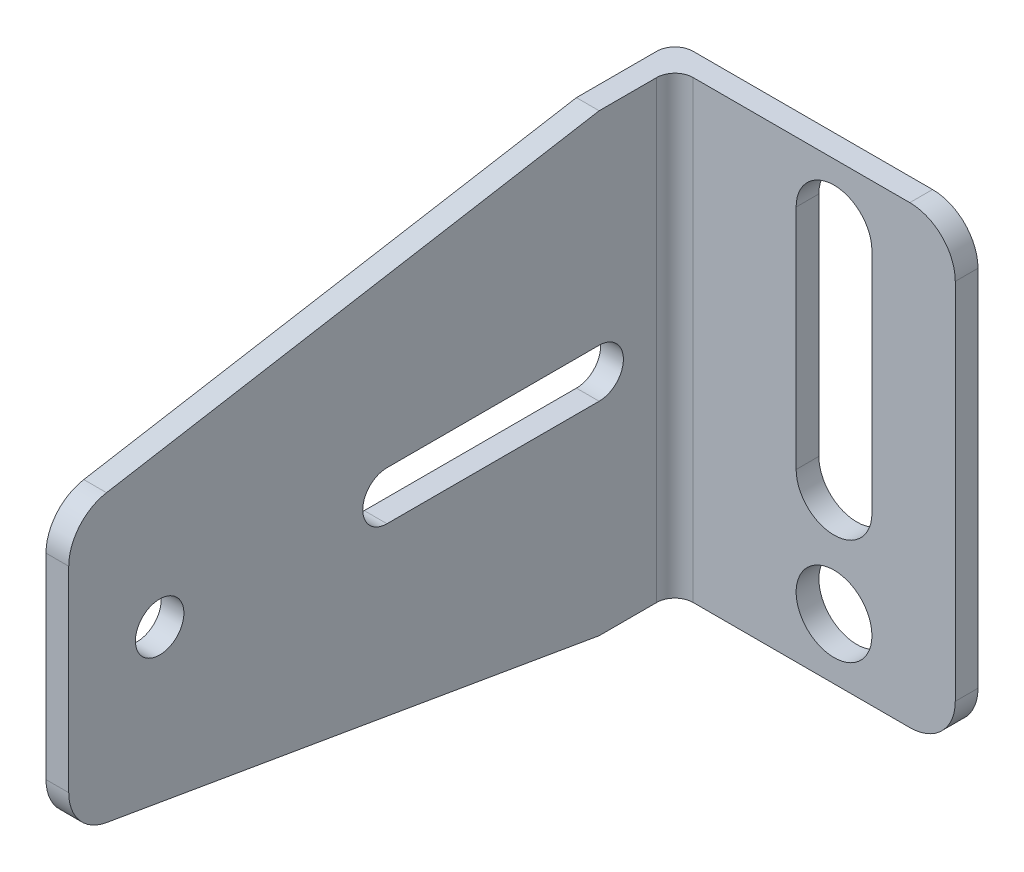
ISO-10303-21;
HEADER;
FILE_DESCRIPTION(('STEP AP214'),'2;1');
FILE_NAME('part.step','',(''),(''),'','','');
FILE_SCHEMA(('AUTOMOTIVE_DESIGN { 1 0 10303 214 1 1 1 1 }'));
ENDSEC;
DATA;
#1=APPLICATION_CONTEXT('core data for automotive mechanical design processes');
#2=APPLICATION_PROTOCOL_DEFINITION('international standard','automotive_design',2000,#1);
#3=PRODUCT_CONTEXT('',#1,'mechanical');
#4=PRODUCT('Part','Part','',(#3));
#5=PRODUCT_RELATED_PRODUCT_CATEGORY('part','',(#4));
#6=PRODUCT_DEFINITION_FORMATION('','',#4);
#7=PRODUCT_DEFINITION_CONTEXT('part definition',#1,'design');
#8=PRODUCT_DEFINITION('design','',#6,#7);
#9=PRODUCT_DEFINITION_SHAPE('','',#8);
#10=(LENGTH_UNIT() NAMED_UNIT(*) SI_UNIT(.MILLI.,.METRE.));
#11=(NAMED_UNIT(*) PLANE_ANGLE_UNIT() SI_UNIT($,.RADIAN.));
#12=(NAMED_UNIT(*) SI_UNIT($,.STERADIAN.) SOLID_ANGLE_UNIT());
#13=UNCERTAINTY_MEASURE_WITH_UNIT(LENGTH_MEASURE(1.E-05),#10,'distance_accuracy_value','');
#14=(GEOMETRIC_REPRESENTATION_CONTEXT(3) GLOBAL_UNCERTAINTY_ASSIGNED_CONTEXT((#13)) GLOBAL_UNIT_ASSIGNED_CONTEXT((#10,
#11,#12)) REPRESENTATION_CONTEXT('',''));
#15=CARTESIAN_POINT('',(0.,0.,0.));
#16=DIRECTION('',(0.,0.,1.));
#17=DIRECTION('',(1.,0.,0.));
#18=AXIS2_PLACEMENT_3D('',#15,#16,#17);
#19=CARTESIAN_POINT('',(0.,0.,1.5));
#20=DIRECTION('',(0.,0.,1.));
#21=DIRECTION('',(1.,0.,0.));
#22=AXIS2_PLACEMENT_3D('',#19,#20,#21);
#23=PLANE('',#22);
#24=DIRECTION('',(0.,-1.,0.));
#25=VECTOR('',#24,1.);
#26=CARTESIAN_POINT('',(9.5,-4.,1.5));
#27=LINE('',#26,#25);
#28=CARTESIAN_POINT('',(9.5,-4.,1.5));
#29=VERTEX_POINT('',#28);
#30=CARTESIAN_POINT('',(9.5,-19.,1.5));
#31=VERTEX_POINT('',#30);
#32=EDGE_CURVE('E269',#29,#31,#27,.T.);
#33=ORIENTED_EDGE('',*,*,#32,.F.);
#34=CARTESIAN_POINT('',(12.,-4.,1.5));
#35=DIRECTION('',(0.,0.,1.));
#36=DIRECTION('',(1.,0.,0.));
#37=AXIS2_PLACEMENT_3D('',#34,#35,#36);
#38=CIRCLE('',#37,2.5);
#39=CARTESIAN_POINT('',(14.5,-4.,1.5));
#40=VERTEX_POINT('',#39);
#41=EDGE_CURVE('E267',#40,#29,#38,.T.);
#42=ORIENTED_EDGE('',*,*,#41,.F.);
#43=DIRECTION('',(0.,1.,0.));
#44=VECTOR('',#43,1.);
#45=CARTESIAN_POINT('',(14.5,-4.,1.5));
#46=LINE('',#45,#44);
#47=CARTESIAN_POINT('',(14.5,-19.,1.5));
#48=VERTEX_POINT('',#47);
#49=EDGE_CURVE('E275',#48,#40,#46,.T.);
#50=ORIENTED_EDGE('',*,*,#49,.F.);
#51=CARTESIAN_POINT('',(12.,-19.,1.5));
#52=DIRECTION('',(0.,0.,1.));
#53=DIRECTION('',(1.,0.,0.));
#54=AXIS2_PLACEMENT_3D('',#51,#52,#53);
#55=CIRCLE('',#54,2.5);
#56=EDGE_CURVE('E272',#31,#48,#55,.T.);
#57=ORIENTED_EDGE('',*,*,#56,.F.);
#58=EDGE_LOOP('',(#33,#42,#50,#57));
#59=FACE_BOUND('',#58,.T.);
#60=CARTESIAN_POINT('',(12.,-26.,1.5));
#61=DIRECTION('',(0.,0.,1.));
#62=DIRECTION('',(1.,0.,0.));
#63=AXIS2_PLACEMENT_3D('',#60,#61,#62);
#64=CIRCLE('',#63,2.49999999999999);
#65=CARTESIAN_POINT('',(14.5,-26.,1.5));
#66=VERTEX_POINT('',#65);
#67=EDGE_CURVE('E261',#66,#66,#64,.T.);
#68=ORIENTED_EDGE('',*,*,#67,.F.);
#69=EDGE_LOOP('',(#68));
#70=FACE_BOUND('',#69,.T.);
#71=DIRECTION('',(1.,0.,0.));
#72=VECTOR('',#71,1.);
#73=CARTESIAN_POINT('',(0.,-30.,1.5));
#74=LINE('',#73,#72);
#75=CARTESIAN_POINT('',(2.7,-30.,1.5));
#76=VERTEX_POINT('',#75);
#77=CARTESIAN_POINT('',(17.,-30.,1.5));
#78=VERTEX_POINT('',#77);
#79=EDGE_CURVE('E298',#76,#78,#74,.T.);
#80=ORIENTED_EDGE('',*,*,#79,.T.);
#81=CARTESIAN_POINT('',(17.,-27.,1.5));
#82=DIRECTION('',(0.,0.,1.));
#83=DIRECTION('',(1.,0.,0.));
#84=AXIS2_PLACEMENT_3D('',#81,#82,#83);
#85=CIRCLE('',#84,3.);
#86=CARTESIAN_POINT('',(20.,-27.,1.5));
#87=VERTEX_POINT('',#86);
#88=EDGE_CURVE('E40',#78,#87,#85,.T.);
#89=ORIENTED_EDGE('',*,*,#88,.T.);
#90=DIRECTION('',(0.,1.,0.));
#91=VECTOR('',#90,1.);
#92=CARTESIAN_POINT('',(20.,0.,1.5));
#93=LINE('',#92,#91);
#94=CARTESIAN_POINT('',(20.,-3.,1.5));
#95=VERTEX_POINT('',#94);
#96=EDGE_CURVE('E300',#87,#95,#93,.T.);
#97=ORIENTED_EDGE('',*,*,#96,.T.);
#98=CARTESIAN_POINT('',(17.,-3.,1.5));
#99=DIRECTION('',(0.,0.,1.));
#100=DIRECTION('',(1.,0.,0.));
#101=AXIS2_PLACEMENT_3D('',#98,#99,#100);
#102=CIRCLE('',#101,3.);
#103=CARTESIAN_POINT('',(17.,0.,1.5));
#104=VERTEX_POINT('',#103);
#105=EDGE_CURVE('E47',#95,#104,#102,.T.);
#106=ORIENTED_EDGE('',*,*,#105,.T.);
#107=DIRECTION('',(-1.,0.,0.));
#108=VECTOR('',#107,1.);
#109=CARTESIAN_POINT('',(0.,0.,1.5));
#110=LINE('',#109,#108);
#111=CARTESIAN_POINT('',(2.7,0.,1.5));
#112=VERTEX_POINT('',#111);
#113=EDGE_CURVE('E303',#104,#112,#110,.T.);
#114=ORIENTED_EDGE('',*,*,#113,.T.);
#115=DIRECTION('',(0.,-1.,0.));
#116=VECTOR('',#115,1.);
#117=CARTESIAN_POINT('',(2.7,0.,1.5));
#118=LINE('',#117,#116);
#119=EDGE_CURVE('E326',#112,#76,#118,.T.);
#120=ORIENTED_EDGE('',*,*,#119,.T.);
#121=EDGE_LOOP('',(#80,#89,#97,#106,#114,#120));
#122=FACE_BOUND('',#121,.T.);
#123=ADVANCED_FACE('F32',(#59,#70,#122),#23,.T.);
#124=CARTESIAN_POINT('',(0.,0.,0.));
#125=DIRECTION('',(0.,0.,1.));
#126=DIRECTION('',(1.,0.,0.));
#127=AXIS2_PLACEMENT_3D('',#124,#125,#126);
#128=PLANE('',#127);
#129=DIRECTION('',(0.,1.,0.));
#130=VECTOR('',#129,1.);
#131=CARTESIAN_POINT('',(20.,0.,0.));
#132=LINE('',#131,#130);
#133=CARTESIAN_POINT('',(20.,-27.,0.));
#134=VERTEX_POINT('',#133);
#135=CARTESIAN_POINT('',(20.,-3.,0.));
#136=VERTEX_POINT('',#135);
#137=EDGE_CURVE('E307',#134,#136,#132,.T.);
#138=ORIENTED_EDGE('',*,*,#137,.F.);
#139=CARTESIAN_POINT('',(17.,-27.,0.));
#140=DIRECTION('',(0.,0.,1.));
#141=DIRECTION('',(1.,0.,0.));
#142=AXIS2_PLACEMENT_3D('',#139,#140,#141);
#143=CIRCLE('',#142,3.);
#144=CARTESIAN_POINT('',(17.,-30.,0.));
#145=VERTEX_POINT('',#144);
#146=EDGE_CURVE('E361',#134,#145,#143,.F.);
#147=ORIENTED_EDGE('',*,*,#146,.T.);
#148=DIRECTION('',(1.,0.,0.));
#149=VECTOR('',#148,1.);
#150=CARTESIAN_POINT('',(0.,-30.,0.));
#151=LINE('',#150,#149);
#152=CARTESIAN_POINT('',(1.2,-30.,0.));
#153=VERTEX_POINT('',#152);
#154=EDGE_CURVE('E297',#153,#145,#151,.T.);
#155=ORIENTED_EDGE('',*,*,#154,.F.);
#156=DIRECTION('',(0.,-1.,0.));
#157=VECTOR('',#156,1.);
#158=CARTESIAN_POINT('',(1.2,0.,0.));
#159=LINE('',#158,#157);
#160=CARTESIAN_POINT('',(1.2,0.,0.));
#161=VERTEX_POINT('',#160);
#162=EDGE_CURVE('E321',#153,#161,#159,.F.);
#163=ORIENTED_EDGE('',*,*,#162,.T.);
#164=DIRECTION('',(-1.,0.,0.));
#165=VECTOR('',#164,1.);
#166=CARTESIAN_POINT('',(0.,0.,0.));
#167=LINE('',#166,#165);
#168=CARTESIAN_POINT('',(17.,0.,0.));
#169=VERTEX_POINT('',#168);
#170=EDGE_CURVE('E301',#169,#161,#167,.T.);
#171=ORIENTED_EDGE('',*,*,#170,.F.);
#172=CARTESIAN_POINT('',(17.,-3.,0.));
#173=DIRECTION('',(0.,0.,1.));
#174=DIRECTION('',(1.,0.,0.));
#175=AXIS2_PLACEMENT_3D('',#172,#173,#174);
#176=CIRCLE('',#175,3.);
#177=EDGE_CURVE('E359',#169,#136,#176,.F.);
#178=ORIENTED_EDGE('',*,*,#177,.T.);
#179=EDGE_LOOP('',(#138,#147,#155,#163,#171,#178));
#180=FACE_BOUND('',#179,.T.);
#181=CARTESIAN_POINT('',(12.,-4.,0.));
#182=DIRECTION('',(0.,0.,1.));
#183=DIRECTION('',(1.,0.,0.));
#184=AXIS2_PLACEMENT_3D('',#181,#182,#183);
#185=CIRCLE('',#184,2.5);
#186=CARTESIAN_POINT('',(14.5,-4.,0.));
#187=VERTEX_POINT('',#186);
#188=CARTESIAN_POINT('',(9.5,-4.,0.));
#189=VERTEX_POINT('',#188);
#190=EDGE_CURVE('E264',#187,#189,#185,.T.);
#191=ORIENTED_EDGE('',*,*,#190,.T.);
#192=DIRECTION('',(0.,-1.,0.));
#193=VECTOR('',#192,1.);
#194=CARTESIAN_POINT('',(9.5,-4.,0.));
#195=LINE('',#194,#193);
#196=CARTESIAN_POINT('',(9.5,-19.,0.));
#197=VERTEX_POINT('',#196);
#198=EDGE_CURVE('E280',#189,#197,#195,.T.);
#199=ORIENTED_EDGE('',*,*,#198,.T.);
#200=CARTESIAN_POINT('',(12.,-19.,0.));
#201=DIRECTION('',(0.,0.,1.));
#202=DIRECTION('',(1.,0.,0.));
#203=AXIS2_PLACEMENT_3D('',#200,#201,#202);
#204=CIRCLE('',#203,2.5);
#205=CARTESIAN_POINT('',(14.5,-19.,0.));
#206=VERTEX_POINT('',#205);
#207=EDGE_CURVE('E283',#197,#206,#204,.T.);
#208=ORIENTED_EDGE('',*,*,#207,.T.);
#209=DIRECTION('',(0.,1.,0.));
#210=VECTOR('',#209,1.);
#211=CARTESIAN_POINT('',(14.5,-4.,0.));
#212=LINE('',#211,#210);
#213=EDGE_CURVE('E270',#206,#187,#212,.T.);
#214=ORIENTED_EDGE('',*,*,#213,.T.);
#215=EDGE_LOOP('',(#191,#199,#208,#214));
#216=FACE_BOUND('',#215,.T.);
#217=CARTESIAN_POINT('',(12.,-26.,0.));
#218=DIRECTION('',(0.,0.,1.));
#219=DIRECTION('',(1.,0.,0.));
#220=AXIS2_PLACEMENT_3D('',#217,#218,#219);
#221=CIRCLE('',#220,2.49999999999999);
#222=CARTESIAN_POINT('',(14.5,-26.,0.));
#223=VERTEX_POINT('',#222);
#224=EDGE_CURVE('E258',#223,#223,#221,.T.);
#225=ORIENTED_EDGE('',*,*,#224,.T.);
#226=EDGE_LOOP('',(#225));
#227=FACE_BOUND('',#226,.T.);
#228=ADVANCED_FACE('F375',(#180,#216,#227),#128,.F.);
#229=CARTESIAN_POINT('',(0.,0.,1.5));
#230=DIRECTION('',(1.,0.,0.));
#231=DIRECTION('',(0.,1.,0.));
#232=AXIS2_PLACEMENT_3D('',#229,#230,#231);
#233=PLANE('',#232);
#234=DIRECTION('',(0.,0.168963815110846,0.985622254813267));
#235=VECTOR('',#234,1.);
#236=CARTESIAN_POINT('',(0.,-30.,6.5));
#237=LINE('',#236,#235);
#238=CARTESIAN_POINT('',(0.,-30.,6.5));
#239=VERTEX_POINT('',#238);
#240=CARTESIAN_POINT('',(0.,-24.427390037943,39.0068914453325));
#241=VERTEX_POINT('',#240);
#242=EDGE_CURVE('E231',#239,#241,#237,.T.);
#243=ORIENTED_EDGE('',*,*,#242,.T.);
#244=CARTESIAN_POINT('',(0.,-21.4705232735032,38.5));
#245=DIRECTION('',(1.,0.,0.));
#246=DIRECTION('',(0.,1.,0.));
#247=AXIS2_PLACEMENT_3D('',#244,#245,#246);
#248=CIRCLE('',#247,3.);
#249=CARTESIAN_POINT('',(0.,-21.4705232735032,41.5));
#250=VERTEX_POINT('',#249);
#251=EDGE_CURVE('E341',#241,#250,#248,.F.);
#252=ORIENTED_EDGE('',*,*,#251,.T.);
#253=DIRECTION('',(0.,1.,0.));
#254=VECTOR('',#253,1.);
#255=CARTESIAN_POINT('',(0.,-24.,41.5));
#256=LINE('',#255,#254);
#257=CARTESIAN_POINT('',(0.,-8.52947672649681,41.5));
#258=VERTEX_POINT('',#257);
#259=EDGE_CURVE('E251',#250,#258,#256,.T.);
#260=ORIENTED_EDGE('',*,*,#259,.T.);
#261=CARTESIAN_POINT('',(0.,-8.52947672649681,38.5));
#262=DIRECTION('',(1.,0.,0.));
#263=DIRECTION('',(0.,1.,0.));
#264=AXIS2_PLACEMENT_3D('',#261,#262,#263);
#265=CIRCLE('',#264,3.);
#266=CARTESIAN_POINT('',(0.,-5.57260996205701,39.0068914453325));
#267=VERTEX_POINT('',#266);
#268=EDGE_CURVE('E339',#258,#267,#265,.F.);
#269=ORIENTED_EDGE('',*,*,#268,.T.);
#270=DIRECTION('',(0.,0.168963815110846,-0.985622254813267));
#271=VECTOR('',#270,1.);
#272=CARTESIAN_POINT('',(0.,-6.,41.5));
#273=LINE('',#272,#271);
#274=CARTESIAN_POINT('',(0.,0.,6.5));
#275=VERTEX_POINT('',#274);
#276=EDGE_CURVE('E238',#267,#275,#273,.T.);
#277=ORIENTED_EDGE('',*,*,#276,.T.);
#278=DIRECTION('',(0.,0.,-1.));
#279=VECTOR('',#278,1.);
#280=CARTESIAN_POINT('',(0.,0.,1.5));
#281=LINE('',#280,#279);
#282=CARTESIAN_POINT('',(0.,0.,1.2));
#283=VERTEX_POINT('',#282);
#284=EDGE_CURVE('E305',#275,#283,#281,.T.);
#285=ORIENTED_EDGE('',*,*,#284,.T.);
#286=DIRECTION('',(0.,-1.,0.));
#287=VECTOR('',#286,1.);
#288=CARTESIAN_POINT('',(0.,0.,1.2));
#289=LINE('',#288,#287);
#290=CARTESIAN_POINT('',(0.,-30.,1.2));
#291=VERTEX_POINT('',#290);
#292=EDGE_CURVE('E316',#283,#291,#289,.T.);
#293=ORIENTED_EDGE('',*,*,#292,.T.);
#294=DIRECTION('',(0.,0.,-1.));
#295=VECTOR('',#294,1.);
#296=CARTESIAN_POINT('',(0.,-30.,1.5));
#297=LINE('',#296,#295);
#298=EDGE_CURVE('E313',#239,#291,#297,.T.);
#299=ORIENTED_EDGE('',*,*,#298,.F.);
#300=EDGE_LOOP('',(#243,#252,#260,#269,#277,#285,#293,#299));
#301=FACE_BOUND('',#300,.T.);
#302=CARTESIAN_POINT('',(0.,-15.,6.5));
#303=DIRECTION('',(-1.,0.,0.));
#304=DIRECTION('',(0.,-1.,0.));
#305=AXIS2_PLACEMENT_3D('',#302,#303,#304);
#306=CIRCLE('',#305,1.6);
#307=CARTESIAN_POINT('',(0.,-13.4,6.5));
#308=VERTEX_POINT('',#307);
#309=CARTESIAN_POINT('',(0.,-16.6,6.5));
#310=VERTEX_POINT('',#309);
#311=EDGE_CURVE('E191',#308,#310,#306,.T.);
#312=ORIENTED_EDGE('',*,*,#311,.F.);
#313=DIRECTION('',(0.,0.,-1.));
#314=VECTOR('',#313,1.);
#315=CARTESIAN_POINT('',(0.,-13.4,6.5));
#316=LINE('',#315,#314);
#317=CARTESIAN_POINT('',(0.,-13.4,20.5));
#318=VERTEX_POINT('',#317);
#319=EDGE_CURVE('E209',#318,#308,#316,.T.);
#320=ORIENTED_EDGE('',*,*,#319,.F.);
#321=CARTESIAN_POINT('',(0.,-15.,20.5));
#322=DIRECTION('',(-1.,0.,0.));
#323=DIRECTION('',(0.,-1.,0.));
#324=AXIS2_PLACEMENT_3D('',#321,#322,#323);
#325=CIRCLE('',#324,1.6);
#326=CARTESIAN_POINT('',(0.,-16.6,20.5));
#327=VERTEX_POINT('',#326);
#328=EDGE_CURVE('E212',#327,#318,#325,.T.);
#329=ORIENTED_EDGE('',*,*,#328,.F.);
#330=DIRECTION('',(0.,0.,1.));
#331=VECTOR('',#330,1.);
#332=CARTESIAN_POINT('',(0.,-16.6,6.5));
#333=LINE('',#332,#331);
#334=EDGE_CURVE('E218',#310,#327,#333,.T.);
#335=ORIENTED_EDGE('',*,*,#334,.F.);
#336=EDGE_LOOP('',(#312,#320,#329,#335));
#337=FACE_BOUND('',#336,.T.);
#338=CARTESIAN_POINT('',(0.,-15.,35.5));
#339=DIRECTION('',(-1.,0.,0.));
#340=DIRECTION('',(0.,-1.,0.));
#341=AXIS2_PLACEMENT_3D('',#338,#339,#340);
#342=CIRCLE('',#341,1.6);
#343=CARTESIAN_POINT('',(0.,-16.6,35.5));
#344=VERTEX_POINT('',#343);
#345=EDGE_CURVE('E224',#344,#344,#342,.T.);
#346=ORIENTED_EDGE('',*,*,#345,.F.);
#347=EDGE_LOOP('',(#346));
#348=FACE_BOUND('',#347,.T.);
#349=ADVANCED_FACE('F384',(#301,#337,#348),#233,.F.);
#350=CARTESIAN_POINT('',(0.,-30.,1.5));
#351=DIRECTION('',(0.,1.,0.));
#352=DIRECTION('',(-1.,0.,0.));
#353=AXIS2_PLACEMENT_3D('',#350,#351,#352);
#354=PLANE('',#353);
#355=ORIENTED_EDGE('',*,*,#154,.T.);
#356=DIRECTION('',(0.,0.,-1.));
#357=VECTOR('',#356,1.);
#358=CARTESIAN_POINT('',(17.,-30.,1.5));
#359=LINE('',#358,#357);
#360=EDGE_CURVE('E55',#145,#78,#359,.F.);
#361=ORIENTED_EDGE('',*,*,#360,.T.);
#362=ORIENTED_EDGE('',*,*,#79,.F.);
#363=CARTESIAN_POINT('',(2.7,-30.,2.7));
#364=DIRECTION('',(0.,1.,0.));
#365=DIRECTION('',(-1.,0.,0.));
#366=AXIS2_PLACEMENT_3D('',#363,#364,#365);
#367=CIRCLE('',#366,1.2);
#368=CARTESIAN_POINT('',(1.5,-30.,2.7));
#369=VERTEX_POINT('',#368);
#370=EDGE_CURVE('E331',#76,#369,#367,.T.);
#371=ORIENTED_EDGE('',*,*,#370,.T.);
#372=DIRECTION('',(0.,0.,1.));
#373=VECTOR('',#372,1.);
#374=CARTESIAN_POINT('',(1.5,-30.,1.5));
#375=LINE('',#374,#373);
#376=CARTESIAN_POINT('',(1.5,-30.,6.5));
#377=VERTEX_POINT('',#376);
#378=EDGE_CURVE('E237',#369,#377,#375,.T.);
#379=ORIENTED_EDGE('',*,*,#378,.T.);
#380=DIRECTION('',(-1.,0.,0.));
#381=VECTOR('',#380,1.);
#382=CARTESIAN_POINT('',(1.5,-30.,6.5));
#383=LINE('',#382,#381);
#384=EDGE_CURVE('E248',#377,#239,#383,.T.);
#385=ORIENTED_EDGE('',*,*,#384,.T.);
#386=ORIENTED_EDGE('',*,*,#298,.T.);
#387=CARTESIAN_POINT('',(1.2,-30.,1.2));
#388=DIRECTION('',(0.,1.,0.));
#389=DIRECTION('',(-1.,0.,0.));
#390=AXIS2_PLACEMENT_3D('',#387,#388,#389);
#391=CIRCLE('',#390,1.2);
#392=EDGE_CURVE('E319',#291,#153,#391,.F.);
#393=ORIENTED_EDGE('',*,*,#392,.T.);
#394=EDGE_LOOP('',(#355,#361,#362,#371,#379,#385,#386,#393));
#395=FACE_BOUND('',#394,.T.);
#396=ADVANCED_FACE('F378',(#395),#354,.F.);
#397=CARTESIAN_POINT('',(20.,0.,1.5));
#398=DIRECTION('',(-1.,0.,0.));
#399=DIRECTION('',(0.,-1.,0.));
#400=AXIS2_PLACEMENT_3D('',#397,#398,#399);
#401=PLANE('',#400);
#402=ORIENTED_EDGE('',*,*,#96,.F.);
#403=DIRECTION('',(0.,0.,-1.));
#404=VECTOR('',#403,1.);
#405=CARTESIAN_POINT('',(20.,-27.,1.5));
#406=LINE('',#405,#404);
#407=EDGE_CURVE('E356',#87,#134,#406,.T.);
#408=ORIENTED_EDGE('',*,*,#407,.T.);
#409=ORIENTED_EDGE('',*,*,#137,.T.);
#410=DIRECTION('',(0.,0.,-1.));
#411=VECTOR('',#410,1.);
#412=CARTESIAN_POINT('',(20.,-3.,1.5));
#413=LINE('',#412,#411);
#414=EDGE_CURVE('E354',#136,#95,#413,.F.);
#415=ORIENTED_EDGE('',*,*,#414,.T.);
#416=EDGE_LOOP('',(#402,#408,#409,#415));
#417=FACE_BOUND('',#416,.T.);
#418=ADVANCED_FACE('F369',(#417),#401,.F.);
#419=CARTESIAN_POINT('',(0.,0.,1.5));
#420=DIRECTION('',(0.,-1.,0.));
#421=DIRECTION('',(0.,0.,-1.));
#422=AXIS2_PLACEMENT_3D('',#419,#420,#421);
#423=PLANE('',#422);
#424=ORIENTED_EDGE('',*,*,#113,.F.);
#425=DIRECTION('',(0.,0.,-1.));
#426=VECTOR('',#425,1.);
#427=CARTESIAN_POINT('',(17.,0.,1.5));
#428=LINE('',#427,#426);
#429=EDGE_CURVE('E11',#104,#169,#428,.T.);
#430=ORIENTED_EDGE('',*,*,#429,.T.);
#431=ORIENTED_EDGE('',*,*,#170,.T.);
#432=CARTESIAN_POINT('',(1.2,0.,1.2));
#433=DIRECTION('',(0.,-1.,0.));
#434=DIRECTION('',(0.,0.,-1.));
#435=AXIS2_PLACEMENT_3D('',#432,#433,#434);
#436=CIRCLE('',#435,1.2);
#437=EDGE_CURVE('E324',#161,#283,#436,.F.);
#438=ORIENTED_EDGE('',*,*,#437,.T.);
#439=ORIENTED_EDGE('',*,*,#284,.F.);
#440=DIRECTION('',(-1.,0.,0.));
#441=VECTOR('',#440,1.);
#442=CARTESIAN_POINT('',(1.5,0.,6.5));
#443=LINE('',#442,#441);
#444=CARTESIAN_POINT('',(1.5,0.,6.5));
#445=VERTEX_POINT('',#444);
#446=EDGE_CURVE('E255',#445,#275,#443,.T.);
#447=ORIENTED_EDGE('',*,*,#446,.F.);
#448=DIRECTION('',(0.,0.,-1.));
#449=VECTOR('',#448,1.);
#450=CARTESIAN_POINT('',(1.5,0.,6.5));
#451=LINE('',#450,#449);
#452=CARTESIAN_POINT('',(1.5,0.,2.7));
#453=VERTEX_POINT('',#452);
#454=EDGE_CURVE('E234',#445,#453,#451,.T.);
#455=ORIENTED_EDGE('',*,*,#454,.T.);
#456=CARTESIAN_POINT('',(2.7,0.,2.7));
#457=DIRECTION('',(0.,-1.,0.));
#458=DIRECTION('',(0.,0.,-1.));
#459=AXIS2_PLACEMENT_3D('',#456,#457,#458);
#460=CIRCLE('',#459,1.2);
#461=EDGE_CURVE('E333',#453,#112,#460,.T.);
#462=ORIENTED_EDGE('',*,*,#461,.T.);
#463=EDGE_LOOP('',(#424,#430,#431,#438,#439,#447,#455,#462));
#464=FACE_BOUND('',#463,.T.);
#465=ADVANCED_FACE('F390',(#464),#423,.F.);
#466=CARTESIAN_POINT('',(12.,-4.,1.5));
#467=DIRECTION('',(0.,0.,-1.));
#468=DIRECTION('',(-1.,0.,0.));
#469=AXIS2_PLACEMENT_3D('',#466,#467,#468);
#470=CYLINDRICAL_SURFACE('',#469,2.5);
#471=ORIENTED_EDGE('',*,*,#190,.F.);
#472=DIRECTION('',(0.,0.,-1.));
#473=VECTOR('',#472,1.);
#474=CARTESIAN_POINT('',(14.5,-4.,1.5));
#475=LINE('',#474,#473);
#476=EDGE_CURVE('E277',#40,#187,#475,.T.);
#477=ORIENTED_EDGE('',*,*,#476,.F.);
#478=ORIENTED_EDGE('',*,*,#41,.T.);
#479=DIRECTION('',(0.,0.,-1.));
#480=VECTOR('',#479,1.);
#481=CARTESIAN_POINT('',(9.5,-4.,1.5));
#482=LINE('',#481,#480);
#483=EDGE_CURVE('E294',#29,#189,#482,.T.);
#484=ORIENTED_EDGE('',*,*,#483,.T.);
#485=EDGE_LOOP('',(#471,#477,#478,#484));
#486=FACE_BOUND('',#485,.T.);
#487=ADVANCED_FACE('F438',(#486),#470,.F.);
#488=CARTESIAN_POINT('',(9.5,-4.,1.5));
#489=DIRECTION('',(1.,0.,0.));
#490=DIRECTION('',(0.,1.,0.));
#491=AXIS2_PLACEMENT_3D('',#488,#489,#490);
#492=PLANE('',#491);
#493=ORIENTED_EDGE('',*,*,#198,.F.);
#494=ORIENTED_EDGE('',*,*,#483,.F.);
#495=ORIENTED_EDGE('',*,*,#32,.T.);
#496=DIRECTION('',(0.,0.,-1.));
#497=VECTOR('',#496,1.);
#498=CARTESIAN_POINT('',(9.5,-19.,1.5));
#499=LINE('',#498,#497);
#500=EDGE_CURVE('E292',#31,#197,#499,.T.);
#501=ORIENTED_EDGE('',*,*,#500,.T.);
#502=EDGE_LOOP('',(#493,#494,#495,#501));
#503=FACE_BOUND('',#502,.T.);
#504=ADVANCED_FACE('F615',(#503),#492,.T.);
#505=CARTESIAN_POINT('',(12.,-19.,1.5));
#506=DIRECTION('',(0.,0.,-1.));
#507=DIRECTION('',(-1.,0.,0.));
#508=AXIS2_PLACEMENT_3D('',#505,#506,#507);
#509=CYLINDRICAL_SURFACE('',#508,2.5);
#510=ORIENTED_EDGE('',*,*,#207,.F.);
#511=ORIENTED_EDGE('',*,*,#500,.F.);
#512=ORIENTED_EDGE('',*,*,#56,.T.);
#513=DIRECTION('',(0.,0.,-1.));
#514=VECTOR('',#513,1.);
#515=CARTESIAN_POINT('',(14.5,-19.,1.5));
#516=LINE('',#515,#514);
#517=EDGE_CURVE('E290',#48,#206,#516,.T.);
#518=ORIENTED_EDGE('',*,*,#517,.T.);
#519=EDGE_LOOP('',(#510,#511,#512,#518));
#520=FACE_BOUND('',#519,.T.);
#521=ADVANCED_FACE('F606',(#520),#509,.F.);
#522=CARTESIAN_POINT('',(14.5,-4.,1.5));
#523=DIRECTION('',(-1.,0.,0.));
#524=DIRECTION('',(0.,-1.,0.));
#525=AXIS2_PLACEMENT_3D('',#522,#523,#524);
#526=PLANE('',#525);
#527=ORIENTED_EDGE('',*,*,#213,.F.);
#528=ORIENTED_EDGE('',*,*,#517,.F.);
#529=ORIENTED_EDGE('',*,*,#49,.T.);
#530=ORIENTED_EDGE('',*,*,#476,.T.);
#531=EDGE_LOOP('',(#527,#528,#529,#530));
#532=FACE_BOUND('',#531,.T.);
#533=ADVANCED_FACE('F597',(#532),#526,.T.);
#534=CARTESIAN_POINT('',(12.,-26.,1.5));
#535=DIRECTION('',(0.,0.,-1.));
#536=DIRECTION('',(-1.,0.,0.));
#537=AXIS2_PLACEMENT_3D('',#534,#535,#536);
#538=CYLINDRICAL_SURFACE('',#537,2.49999999999999);
#539=ORIENTED_EDGE('',*,*,#67,.T.);
#540=EDGE_LOOP('',(#539));
#541=FACE_BOUND('',#540,.T.);
#542=ORIENTED_EDGE('',*,*,#224,.F.);
#543=EDGE_LOOP('',(#542));
#544=FACE_BOUND('',#543,.T.);
#545=ADVANCED_FACE('F557',(#541,#544),#538,.F.);
#546=CARTESIAN_POINT('',(1.5,-6.,41.5));
#547=DIRECTION('',(0.,0.985622254813267,0.168963815110846));
#548=DIRECTION('',(0.,-0.168963815110846,0.985622254813267));
#549=AXIS2_PLACEMENT_3D('',#546,#547,#548);
#550=PLANE('',#549);
#551=ORIENTED_EDGE('',*,*,#276,.F.);
#552=DIRECTION('',(-1.,0.,0.));
#553=VECTOR('',#552,1.);
#554=CARTESIAN_POINT('',(1.5,-5.57260996205701,39.0068914453325));
#555=LINE('',#554,#553);
#556=CARTESIAN_POINT('',(1.5,-5.57260996205701,39.0068914453325));
#557=VERTEX_POINT('',#556);
#558=EDGE_CURVE('E352',#267,#557,#555,.F.);
#559=ORIENTED_EDGE('',*,*,#558,.T.);
#560=DIRECTION('',(0.,0.168963815110846,-0.985622254813267));
#561=VECTOR('',#560,1.);
#562=CARTESIAN_POINT('',(1.5,-6.,41.5));
#563=LINE('',#562,#561);
#564=EDGE_CURVE('E246',#557,#445,#563,.T.);
#565=ORIENTED_EDGE('',*,*,#564,.T.);
#566=ORIENTED_EDGE('',*,*,#446,.T.);
#567=EDGE_LOOP('',(#551,#559,#565,#566));
#568=FACE_BOUND('',#567,.T.);
#569=ADVANCED_FACE('F393',(#568),#550,.T.);
#570=CARTESIAN_POINT('',(1.5,-24.,41.5));
#571=DIRECTION('',(0.,0.,1.));
#572=DIRECTION('',(1.,0.,0.));
#573=AXIS2_PLACEMENT_3D('',#570,#571,#572);
#574=PLANE('',#573);
#575=ORIENTED_EDGE('',*,*,#259,.F.);
#576=DIRECTION('',(-1.,0.,0.));
#577=VECTOR('',#576,1.);
#578=CARTESIAN_POINT('',(1.5,-21.4705232735032,41.5));
#579=LINE('',#578,#577);
#580=CARTESIAN_POINT('',(1.5,-21.4705232735032,41.5));
#581=VERTEX_POINT('',#580);
#582=EDGE_CURVE('E346',#250,#581,#579,.F.);
#583=ORIENTED_EDGE('',*,*,#582,.T.);
#584=DIRECTION('',(0.,1.,0.));
#585=VECTOR('',#584,1.);
#586=CARTESIAN_POINT('',(1.5,-24.,41.5));
#587=LINE('',#586,#585);
#588=CARTESIAN_POINT('',(1.5,-8.52947672649681,41.5));
#589=VERTEX_POINT('',#588);
#590=EDGE_CURVE('E243',#581,#589,#587,.T.);
#591=ORIENTED_EDGE('',*,*,#590,.T.);
#592=DIRECTION('',(-1.,0.,0.));
#593=VECTOR('',#592,1.);
#594=CARTESIAN_POINT('',(1.5,-8.52947672649681,41.5));
#595=LINE('',#594,#593);
#596=EDGE_CURVE('E343',#589,#258,#595,.T.);
#597=ORIENTED_EDGE('',*,*,#596,.T.);
#598=EDGE_LOOP('',(#575,#583,#591,#597));
#599=FACE_BOUND('',#598,.T.);
#600=ADVANCED_FACE('F404',(#599),#574,.T.);
#601=CARTESIAN_POINT('',(1.5,-30.,6.5));
#602=DIRECTION('',(0.,-0.985622254813267,0.168963815110846));
#603=DIRECTION('',(0.,-0.168963815110846,-0.985622254813267));
#604=AXIS2_PLACEMENT_3D('',#601,#602,#603);
#605=PLANE('',#604);
#606=DIRECTION('',(0.,0.168963815110846,0.985622254813267));
#607=VECTOR('',#606,1.);
#608=CARTESIAN_POINT('',(1.5,-30.,6.5));
#609=LINE('',#608,#607);
#610=CARTESIAN_POINT('',(1.5,-24.427390037943,39.0068914453325));
#611=VERTEX_POINT('',#610);
#612=EDGE_CURVE('E240',#377,#611,#609,.T.);
#613=ORIENTED_EDGE('',*,*,#612,.T.);
#614=DIRECTION('',(-1.,0.,0.));
#615=VECTOR('',#614,1.);
#616=CARTESIAN_POINT('',(1.5,-24.427390037943,39.0068914453325));
#617=LINE('',#616,#615);
#618=EDGE_CURVE('E336',#611,#241,#617,.T.);
#619=ORIENTED_EDGE('',*,*,#618,.T.);
#620=ORIENTED_EDGE('',*,*,#242,.F.);
#621=ORIENTED_EDGE('',*,*,#384,.F.);
#622=EDGE_LOOP('',(#613,#619,#620,#621));
#623=FACE_BOUND('',#622,.T.);
#624=ADVANCED_FACE('F412',(#623),#605,.T.);
#625=CARTESIAN_POINT('',(1.5,0.,0.));
#626=DIRECTION('',(-1.,0.,0.));
#627=DIRECTION('',(0.,-1.,0.));
#628=AXIS2_PLACEMENT_3D('',#625,#626,#627);
#629=PLANE('',#628);
#630=DIRECTION('',(0.,0.,-1.));
#631=VECTOR('',#630,1.);
#632=CARTESIAN_POINT('',(1.5,-13.4,6.5));
#633=LINE('',#632,#631);
#634=CARTESIAN_POINT('',(1.5,-13.4,20.5));
#635=VERTEX_POINT('',#634);
#636=CARTESIAN_POINT('',(1.5,-13.4,6.5));
#637=VERTEX_POINT('',#636);
#638=EDGE_CURVE('E196',#635,#637,#633,.T.);
#639=ORIENTED_EDGE('',*,*,#638,.T.);
#640=CARTESIAN_POINT('',(1.5,-15.,6.5));
#641=DIRECTION('',(-1.,0.,0.));
#642=DIRECTION('',(0.,-1.,0.));
#643=AXIS2_PLACEMENT_3D('',#640,#641,#642);
#644=CIRCLE('',#643,1.6);
#645=CARTESIAN_POINT('',(1.5,-16.6,6.5));
#646=VERTEX_POINT('',#645);
#647=EDGE_CURVE('E188',#637,#646,#644,.T.);
#648=ORIENTED_EDGE('',*,*,#647,.T.);
#649=DIRECTION('',(0.,0.,1.));
#650=VECTOR('',#649,1.);
#651=CARTESIAN_POINT('',(1.5,-16.6,6.5));
#652=LINE('',#651,#650);
#653=CARTESIAN_POINT('',(1.5,-16.6,20.5));
#654=VERTEX_POINT('',#653);
#655=EDGE_CURVE('E200',#646,#654,#652,.T.);
#656=ORIENTED_EDGE('',*,*,#655,.T.);
#657=CARTESIAN_POINT('',(1.5,-15.,20.5));
#658=DIRECTION('',(-1.,0.,0.));
#659=DIRECTION('',(0.,-1.,0.));
#660=AXIS2_PLACEMENT_3D('',#657,#658,#659);
#661=CIRCLE('',#660,1.6);
#662=EDGE_CURVE('E204',#654,#635,#661,.T.);
#663=ORIENTED_EDGE('',*,*,#662,.T.);
#664=EDGE_LOOP('',(#639,#648,#656,#663));
#665=FACE_BOUND('',#664,.T.);
#666=CARTESIAN_POINT('',(1.5,-15.,35.5));
#667=DIRECTION('',(-1.,0.,0.));
#668=DIRECTION('',(0.,-1.,0.));
#669=AXIS2_PLACEMENT_3D('',#666,#667,#668);
#670=CIRCLE('',#669,1.6);
#671=CARTESIAN_POINT('',(1.5,-16.6,35.5));
#672=VERTEX_POINT('',#671);
#673=EDGE_CURVE('E228',#672,#672,#670,.T.);
#674=ORIENTED_EDGE('',*,*,#673,.T.);
#675=EDGE_LOOP('',(#674));
#676=FACE_BOUND('',#675,.T.);
#677=ORIENTED_EDGE('',*,*,#590,.F.);
#678=CARTESIAN_POINT('',(1.5,-21.4705232735032,38.5));
#679=DIRECTION('',(-1.,0.,0.));
#680=DIRECTION('',(0.,-1.,0.));
#681=AXIS2_PLACEMENT_3D('',#678,#679,#680);
#682=CIRCLE('',#681,3.);
#683=EDGE_CURVE('E350',#581,#611,#682,.F.);
#684=ORIENTED_EDGE('',*,*,#683,.T.);
#685=ORIENTED_EDGE('',*,*,#612,.F.);
#686=ORIENTED_EDGE('',*,*,#378,.F.);
#687=DIRECTION('',(0.,-1.,0.));
#688=VECTOR('',#687,1.);
#689=CARTESIAN_POINT('',(1.5,0.,2.7));
#690=LINE('',#689,#688);
#691=EDGE_CURVE('E329',#369,#453,#690,.F.);
#692=ORIENTED_EDGE('',*,*,#691,.T.);
#693=ORIENTED_EDGE('',*,*,#454,.F.);
#694=ORIENTED_EDGE('',*,*,#564,.F.);
#695=CARTESIAN_POINT('',(1.5,-8.52947672649681,38.5));
#696=DIRECTION('',(-1.,0.,0.));
#697=DIRECTION('',(0.,-1.,0.));
#698=AXIS2_PLACEMENT_3D('',#695,#696,#697);
#699=CIRCLE('',#698,3.);
#700=EDGE_CURVE('E348',#557,#589,#699,.F.);
#701=ORIENTED_EDGE('',*,*,#700,.T.);
#702=EDGE_LOOP('',(#677,#684,#685,#686,#692,#693,#694,#701));
#703=FACE_BOUND('',#702,.T.);
#704=ADVANCED_FACE('F206',(#665,#676,#703),#629,.F.);
#705=CARTESIAN_POINT('',(1.5,-15.,35.5));
#706=DIRECTION('',(-1.,0.,0.));
#707=DIRECTION('',(0.,-1.,0.));
#708=AXIS2_PLACEMENT_3D('',#705,#706,#707);
#709=CYLINDRICAL_SURFACE('',#708,1.6);
#710=ORIENTED_EDGE('',*,*,#673,.F.);
#711=EDGE_LOOP('',(#710));
#712=FACE_BOUND('',#711,.T.);
#713=ORIENTED_EDGE('',*,*,#345,.T.);
#714=EDGE_LOOP('',(#713));
#715=FACE_BOUND('',#714,.T.);
#716=ADVANCED_FACE('F520',(#712,#715),#709,.F.);
#717=CARTESIAN_POINT('',(1.5,-15.,6.5));
#718=DIRECTION('',(-1.,0.,0.));
#719=DIRECTION('',(0.,-1.,0.));
#720=AXIS2_PLACEMENT_3D('',#717,#718,#719);
#721=CYLINDRICAL_SURFACE('',#720,1.6);
#722=ORIENTED_EDGE('',*,*,#311,.T.);
#723=DIRECTION('',(-1.,0.,0.));
#724=VECTOR('',#723,1.);
#725=CARTESIAN_POINT('',(1.5,-16.6,6.5));
#726=LINE('',#725,#724);
#727=EDGE_CURVE('E184',#646,#310,#726,.T.);
#728=ORIENTED_EDGE('',*,*,#727,.F.);
#729=ORIENTED_EDGE('',*,*,#647,.F.);
#730=DIRECTION('',(-1.,0.,0.));
#731=VECTOR('',#730,1.);
#732=CARTESIAN_POINT('',(1.5,-13.4,6.5));
#733=LINE('',#732,#731);
#734=EDGE_CURVE('E222',#637,#308,#733,.T.);
#735=ORIENTED_EDGE('',*,*,#734,.T.);
#736=EDGE_LOOP('',(#722,#728,#729,#735));
#737=FACE_BOUND('',#736,.T.);
#738=ADVANCED_FACE('F186',(#737),#721,.F.);
#739=CARTESIAN_POINT('',(1.5,-13.4,6.5));
#740=DIRECTION('',(0.,1.,0.));
#741=DIRECTION('',(0.,0.,1.));
#742=AXIS2_PLACEMENT_3D('',#739,#740,#741);
#743=PLANE('',#742);
#744=ORIENTED_EDGE('',*,*,#319,.T.);
#745=ORIENTED_EDGE('',*,*,#734,.F.);
#746=ORIENTED_EDGE('',*,*,#638,.F.);
#747=DIRECTION('',(-1.,0.,0.));
#748=VECTOR('',#747,1.);
#749=CARTESIAN_POINT('',(1.5,-13.4,20.5));
#750=LINE('',#749,#748);
#751=EDGE_CURVE('E225',#635,#318,#750,.T.);
#752=ORIENTED_EDGE('',*,*,#751,.T.);
#753=EDGE_LOOP('',(#744,#745,#746,#752));
#754=FACE_BOUND('',#753,.T.);
#755=ADVANCED_FACE('F503',(#754),#743,.F.);
#756=CARTESIAN_POINT('',(1.5,-15.,20.5));
#757=DIRECTION('',(-1.,0.,0.));
#758=DIRECTION('',(0.,-1.,0.));
#759=AXIS2_PLACEMENT_3D('',#756,#757,#758);
#760=CYLINDRICAL_SURFACE('',#759,1.6);
#761=ORIENTED_EDGE('',*,*,#328,.T.);
#762=ORIENTED_EDGE('',*,*,#751,.F.);
#763=ORIENTED_EDGE('',*,*,#662,.F.);
#764=DIRECTION('',(-1.,0.,0.));
#765=VECTOR('',#764,1.);
#766=CARTESIAN_POINT('',(1.5,-16.6,20.5));
#767=LINE('',#766,#765);
#768=EDGE_CURVE('E195',#654,#327,#767,.T.);
#769=ORIENTED_EDGE('',*,*,#768,.T.);
#770=EDGE_LOOP('',(#761,#762,#763,#769));
#771=FACE_BOUND('',#770,.T.);
#772=ADVANCED_FACE('F495',(#771),#760,.F.);
#773=CARTESIAN_POINT('',(1.5,-16.6,6.5));
#774=DIRECTION('',(0.,-1.,0.));
#775=DIRECTION('',(0.,0.,-1.));
#776=AXIS2_PLACEMENT_3D('',#773,#774,#775);
#777=PLANE('',#776);
#778=ORIENTED_EDGE('',*,*,#334,.T.);
#779=ORIENTED_EDGE('',*,*,#768,.F.);
#780=ORIENTED_EDGE('',*,*,#655,.F.);
#781=ORIENTED_EDGE('',*,*,#727,.T.);
#782=EDGE_LOOP('',(#778,#779,#780,#781));
#783=FACE_BOUND('',#782,.T.);
#784=ADVANCED_FACE('F201',(#783),#777,.F.);
#785=CARTESIAN_POINT('',(1.2,0.,1.2));
#786=DIRECTION('',(0.,-1.,0.));
#787=DIRECTION('',(1.,0.,0.));
#788=AXIS2_PLACEMENT_3D('',#785,#786,#787);
#789=CYLINDRICAL_SURFACE('',#788,1.2);
#790=ORIENTED_EDGE('',*,*,#437,.F.);
#791=ORIENTED_EDGE('',*,*,#162,.F.);
#792=ORIENTED_EDGE('',*,*,#392,.F.);
#793=ORIENTED_EDGE('',*,*,#292,.F.);
#794=EDGE_LOOP('',(#790,#791,#792,#793));
#795=FACE_BOUND('',#794,.T.);
#796=ADVANCED_FACE('F382',(#795),#789,.T.);
#797=CARTESIAN_POINT('',(2.7,0.,2.7));
#798=DIRECTION('',(0.,-1.,0.));
#799=DIRECTION('',(1.,0.,0.));
#800=AXIS2_PLACEMENT_3D('',#797,#798,#799);
#801=CYLINDRICAL_SURFACE('',#800,1.2);
#802=ORIENTED_EDGE('',*,*,#461,.F.);
#803=ORIENTED_EDGE('',*,*,#691,.F.);
#804=ORIENTED_EDGE('',*,*,#370,.F.);
#805=ORIENTED_EDGE('',*,*,#119,.F.);
#806=EDGE_LOOP('',(#802,#803,#804,#805));
#807=FACE_BOUND('',#806,.T.);
#808=ADVANCED_FACE('F419',(#807),#801,.F.);
#809=CARTESIAN_POINT('',(1.5,-21.4705232735032,38.5));
#810=DIRECTION('',(-1.,0.,0.));
#811=DIRECTION('',(0.,-1.,0.));
#812=AXIS2_PLACEMENT_3D('',#809,#810,#811);
#813=CYLINDRICAL_SURFACE('',#812,3.);
#814=ORIENTED_EDGE('',*,*,#683,.F.);
#815=ORIENTED_EDGE('',*,*,#582,.F.);
#816=ORIENTED_EDGE('',*,*,#251,.F.);
#817=ORIENTED_EDGE('',*,*,#618,.F.);
#818=EDGE_LOOP('',(#814,#815,#816,#817));
#819=FACE_BOUND('',#818,.T.);
#820=ADVANCED_FACE('F410',(#819),#813,.T.);
#821=CARTESIAN_POINT('',(1.5,-8.52947672649681,38.5));
#822=DIRECTION('',(-1.,0.,0.));
#823=DIRECTION('',(0.,-1.,0.));
#824=AXIS2_PLACEMENT_3D('',#821,#822,#823);
#825=CYLINDRICAL_SURFACE('',#824,3.);
#826=ORIENTED_EDGE('',*,*,#700,.F.);
#827=ORIENTED_EDGE('',*,*,#558,.F.);
#828=ORIENTED_EDGE('',*,*,#268,.F.);
#829=ORIENTED_EDGE('',*,*,#596,.F.);
#830=EDGE_LOOP('',(#826,#827,#828,#829));
#831=FACE_BOUND('',#830,.T.);
#832=ADVANCED_FACE('F401',(#831),#825,.T.);
#833=CARTESIAN_POINT('',(17.,-27.,1.5));
#834=DIRECTION('',(0.,0.,-1.));
#835=DIRECTION('',(-1.,0.,0.));
#836=AXIS2_PLACEMENT_3D('',#833,#834,#835);
#837=CYLINDRICAL_SURFACE('',#836,3.);
#838=ORIENTED_EDGE('',*,*,#88,.F.);
#839=ORIENTED_EDGE('',*,*,#360,.F.);
#840=ORIENTED_EDGE('',*,*,#146,.F.);
#841=ORIENTED_EDGE('',*,*,#407,.F.);
#842=EDGE_LOOP('',(#838,#839,#840,#841));
#843=FACE_BOUND('',#842,.T.);
#844=ADVANCED_FACE('F372',(#843),#837,.T.);
#845=CARTESIAN_POINT('',(17.,-3.,1.5));
#846=DIRECTION('',(0.,0.,-1.));
#847=DIRECTION('',(-1.,0.,0.));
#848=AXIS2_PLACEMENT_3D('',#845,#846,#847);
#849=CYLINDRICAL_SURFACE('',#848,3.);
#850=ORIENTED_EDGE('',*,*,#105,.F.);
#851=ORIENTED_EDGE('',*,*,#414,.F.);
#852=ORIENTED_EDGE('',*,*,#177,.F.);
#853=ORIENTED_EDGE('',*,*,#429,.F.);
#854=EDGE_LOOP('',(#850,#851,#852,#853));
#855=FACE_BOUND('',#854,.T.);
#856=ADVANCED_FACE('F34',(#855),#849,.T.);
#857=CLOSED_SHELL('',(#123,#228,#349,#396,#418,#465,#487,#504,#521,#533,#545,#569,#600,#624,
#704,#716,#738,#755,#772,#784,#796,#808,#820,#832,#844,#856));
#858=MANIFOLD_SOLID_BREP('B2',#857);
#859=ADVANCED_BREP_SHAPE_REPRESENTATION('',(#18,#858),#14);
#860=SHAPE_DEFINITION_REPRESENTATION(#9,#859);
ENDSEC;
END-ISO-10303-21;
